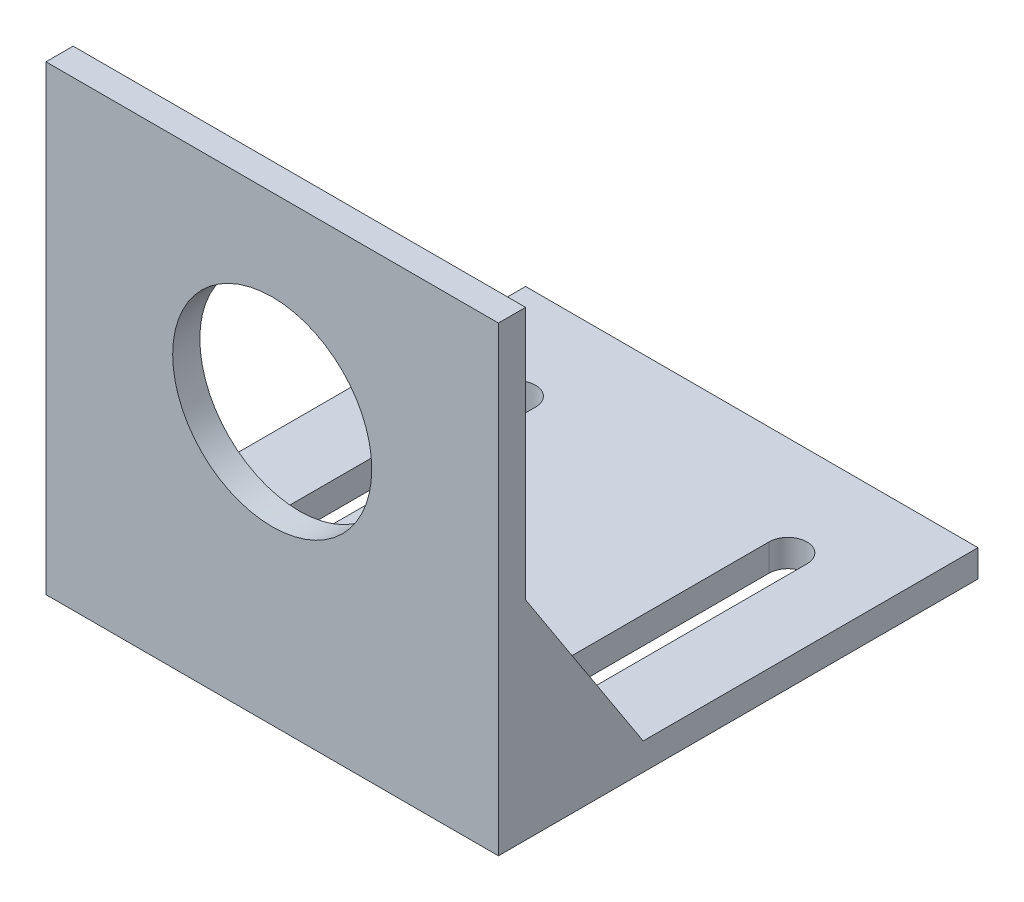
ISO-10303-21;
HEADER;
FILE_DESCRIPTION(('STEP AP214'),'2;1');
FILE_NAME('part.step','',(''),(''),'','','');
FILE_SCHEMA(('AUTOMOTIVE_DESIGN { 1 0 10303 214 1 1 1 1 }'));
ENDSEC;
DATA;
#1=APPLICATION_CONTEXT('core data for automotive mechanical design processes');
#2=APPLICATION_PROTOCOL_DEFINITION('international standard','automotive_design',2000,#1);
#3=PRODUCT_CONTEXT('',#1,'mechanical');
#4=PRODUCT('Part','Part','',(#3));
#5=PRODUCT_RELATED_PRODUCT_CATEGORY('part','',(#4));
#6=PRODUCT_DEFINITION_FORMATION('','',#4);
#7=PRODUCT_DEFINITION_CONTEXT('part definition',#1,'design');
#8=PRODUCT_DEFINITION('design','',#6,#7);
#9=PRODUCT_DEFINITION_SHAPE('','',#8);
#10=(LENGTH_UNIT() NAMED_UNIT(*) SI_UNIT(.MILLI.,.METRE.));
#11=(NAMED_UNIT(*) PLANE_ANGLE_UNIT() SI_UNIT($,.RADIAN.));
#12=(NAMED_UNIT(*) SI_UNIT($,.STERADIAN.) SOLID_ANGLE_UNIT());
#13=UNCERTAINTY_MEASURE_WITH_UNIT(LENGTH_MEASURE(1.E-05),#10,'distance_accuracy_value','');
#14=(GEOMETRIC_REPRESENTATION_CONTEXT(3) GLOBAL_UNCERTAINTY_ASSIGNED_CONTEXT((#13)) GLOBAL_UNIT_ASSIGNED_CONTEXT((#10,
#11,#12)) REPRESENTATION_CONTEXT('',''));
#15=CARTESIAN_POINT('',(0.,0.,0.));
#16=DIRECTION('',(0.,0.,1.));
#17=DIRECTION('',(1.,0.,0.));
#18=AXIS2_PLACEMENT_3D('',#15,#16,#17);
#19=CARTESIAN_POINT('',(0.,3.,0.));
#20=DIRECTION('',(0.,-1.,0.));
#21=DIRECTION('',(0.,0.,-1.));
#22=AXIS2_PLACEMENT_3D('',#19,#20,#21);
#23=PLANE('',#22);
#24=CARTESIAN_POINT('',(40.,3.,-12.));
#25=DIRECTION('',(0.,1.,0.));
#26=DIRECTION('',(0.,0.,-1.));
#27=AXIS2_PLACEMENT_3D('',#24,#25,#26);
#28=CIRCLE('',#27,2.1);
#29=CARTESIAN_POINT('',(37.9,3.,-12.));
#30=VERTEX_POINT('',#29);
#31=CARTESIAN_POINT('',(42.1,3.,-12.));
#32=VERTEX_POINT('',#31);
#33=EDGE_CURVE('E207',#30,#32,#28,.T.);
#34=ORIENTED_EDGE('',*,*,#33,.F.);
#35=DIRECTION('',(0.,0.,1.));
#36=VECTOR('',#35,1.);
#37=CARTESIAN_POINT('',(37.9,3.,-12.));
#38=LINE('',#37,#36);
#39=CARTESIAN_POINT('',(37.9,3.,-42.));
#40=VERTEX_POINT('',#39);
#41=EDGE_CURVE('E214',#40,#30,#38,.T.);
#42=ORIENTED_EDGE('',*,*,#41,.F.);
#43=CARTESIAN_POINT('',(40.,3.,-42.));
#44=DIRECTION('',(0.,1.,0.));
#45=DIRECTION('',(0.,0.,-1.));
#46=AXIS2_PLACEMENT_3D('',#43,#44,#45);
#47=CIRCLE('',#46,2.1);
#48=CARTESIAN_POINT('',(42.1,3.,-42.));
#49=VERTEX_POINT('',#48);
#50=EDGE_CURVE('E212',#49,#40,#47,.T.);
#51=ORIENTED_EDGE('',*,*,#50,.F.);
#52=DIRECTION('',(0.,0.,-1.));
#53=VECTOR('',#52,1.);
#54=CARTESIAN_POINT('',(42.1,3.,-12.));
#55=LINE('',#54,#53);
#56=EDGE_CURVE('E209',#32,#49,#55,.T.);
#57=ORIENTED_EDGE('',*,*,#56,.F.);
#58=EDGE_LOOP('',(#34,#42,#51,#57));
#59=FACE_BOUND('',#58,.T.);
#60=CARTESIAN_POINT('',(10.,3.,-12.));
#61=DIRECTION('',(0.,1.,0.));
#62=DIRECTION('',(0.,0.,1.));
#63=AXIS2_PLACEMENT_3D('',#60,#61,#62);
#64=CIRCLE('',#63,2.1);
#65=CARTESIAN_POINT('',(7.9,3.,-12.));
#66=VERTEX_POINT('',#65);
#67=CARTESIAN_POINT('',(12.1,3.,-12.));
#68=VERTEX_POINT('',#67);
#69=EDGE_CURVE('E236',#66,#68,#64,.T.);
#70=ORIENTED_EDGE('',*,*,#69,.F.);
#71=DIRECTION('',(0.,0.,1.));
#72=VECTOR('',#71,1.);
#73=CARTESIAN_POINT('',(7.9,3.,-12.));
#74=LINE('',#73,#72);
#75=CARTESIAN_POINT('',(7.9,3.,-42.));
#76=VERTEX_POINT('',#75);
#77=EDGE_CURVE('E244',#76,#66,#74,.T.);
#78=ORIENTED_EDGE('',*,*,#77,.F.);
#79=CARTESIAN_POINT('',(10.,3.,-42.));
#80=DIRECTION('',(0.,1.,0.));
#81=DIRECTION('',(0.,0.,1.));
#82=AXIS2_PLACEMENT_3D('',#79,#80,#81);
#83=CIRCLE('',#82,2.1);
#84=CARTESIAN_POINT('',(12.1,3.,-42.));
#85=VERTEX_POINT('',#84);
#86=EDGE_CURVE('E241',#85,#76,#83,.T.);
#87=ORIENTED_EDGE('',*,*,#86,.F.);
#88=DIRECTION('',(0.,0.,-1.));
#89=VECTOR('',#88,1.);
#90=CARTESIAN_POINT('',(12.1,3.,-12.));
#91=LINE('',#90,#89);
#92=EDGE_CURVE('E238',#68,#85,#91,.T.);
#93=ORIENTED_EDGE('',*,*,#92,.F.);
#94=EDGE_LOOP('',(#70,#78,#87,#93));
#95=FACE_BOUND('',#94,.T.);
#96=DIRECTION('',(-1.,0.,0.));
#97=VECTOR('',#96,1.);
#98=CARTESIAN_POINT('',(3.,3.,-16.));
#99=LINE('',#98,#97);
#100=CARTESIAN_POINT('',(3.,3.,-16.));
#101=VERTEX_POINT('',#100);
#102=CARTESIAN_POINT('',(0.,3.,-16.));
#103=VERTEX_POINT('',#102);
#104=EDGE_CURVE('E177',#101,#103,#99,.T.);
#105=ORIENTED_EDGE('',*,*,#104,.F.);
#106=DIRECTION('',(0.,0.,-1.));
#107=VECTOR('',#106,1.);
#108=CARTESIAN_POINT('',(3.,3.,-2.99999999999999));
#109=LINE('',#108,#107);
#110=CARTESIAN_POINT('',(3.,3.,-2.99999999999999));
#111=VERTEX_POINT('',#110);
#112=EDGE_CURVE('E163',#111,#101,#109,.T.);
#113=ORIENTED_EDGE('',*,*,#112,.F.);
#114=DIRECTION('',(1.,0.,0.));
#115=VECTOR('',#114,1.);
#116=CARTESIAN_POINT('',(0.,3.,-3.));
#117=LINE('',#116,#115);
#118=CARTESIAN_POINT('',(47.,3.,-3.));
#119=VERTEX_POINT('',#118);
#120=EDGE_CURVE('E173',#111,#119,#117,.T.);
#121=ORIENTED_EDGE('',*,*,#120,.T.);
#122=DIRECTION('',(0.,0.,-1.));
#123=VECTOR('',#122,1.);
#124=CARTESIAN_POINT('',(47.,3.,-3.));
#125=LINE('',#124,#123);
#126=CARTESIAN_POINT('',(47.,3.,-16.));
#127=VERTEX_POINT('',#126);
#128=EDGE_CURVE('E306',#119,#127,#125,.T.);
#129=ORIENTED_EDGE('',*,*,#128,.T.);
#130=DIRECTION('',(1.,0.,0.));
#131=VECTOR('',#130,1.);
#132=CARTESIAN_POINT('',(47.,3.,-16.));
#133=LINE('',#132,#131);
#134=CARTESIAN_POINT('',(50.,3.,-16.));
#135=VERTEX_POINT('',#134);
#136=EDGE_CURVE('E305',#127,#135,#133,.T.);
#137=ORIENTED_EDGE('',*,*,#136,.T.);
#138=DIRECTION('',(0.,0.,-1.));
#139=VECTOR('',#138,1.);
#140=CARTESIAN_POINT('',(50.,3.,0.));
#141=LINE('',#140,#139);
#142=CARTESIAN_POINT('',(50.,3.,-53.));
#143=VERTEX_POINT('',#142);
#144=EDGE_CURVE('E269',#135,#143,#141,.T.);
#145=ORIENTED_EDGE('',*,*,#144,.T.);
#146=DIRECTION('',(-1.,0.,0.));
#147=VECTOR('',#146,1.);
#148=CARTESIAN_POINT('',(0.,3.,-53.));
#149=LINE('',#148,#147);
#150=CARTESIAN_POINT('',(0.,3.,-53.));
#151=VERTEX_POINT('',#150);
#152=EDGE_CURVE('E272',#143,#151,#149,.T.);
#153=ORIENTED_EDGE('',*,*,#152,.T.);
#154=DIRECTION('',(0.,0.,1.));
#155=VECTOR('',#154,1.);
#156=CARTESIAN_POINT('',(0.,3.,0.));
#157=LINE('',#156,#155);
#158=EDGE_CURVE('E267',#151,#103,#157,.T.);
#159=ORIENTED_EDGE('',*,*,#158,.T.);
#160=EDGE_LOOP('',(#105,#113,#121,#129,#137,#145,#153,#159));
#161=FACE_BOUND('',#160,.T.);
#162=ADVANCED_FACE('F35',(#59,#95,#161),#23,.F.);
#163=CARTESIAN_POINT('',(0.,0.,-3.));
#164=DIRECTION('',(0.,0.,-1.));
#165=DIRECTION('',(-1.,0.,0.));
#166=AXIS2_PLACEMENT_3D('',#163,#164,#165);
#167=PLANE('',#166);
#168=CARTESIAN_POINT('',(25.,30.,-3.));
#169=DIRECTION('',(0.,0.,1.));
#170=DIRECTION('',(1.,0.,0.));
#171=AXIS2_PLACEMENT_3D('',#168,#169,#170);
#172=CIRCLE('',#171,11.);
#173=CARTESIAN_POINT('',(36.,30.,-3.));
#174=VERTEX_POINT('',#173);
#175=EDGE_CURVE('E200',#174,#174,#172,.T.);
#176=ORIENTED_EDGE('',*,*,#175,.T.);
#177=EDGE_LOOP('',(#176));
#178=FACE_BOUND('',#177,.T.);
#179=DIRECTION('',(0.,-1.,0.));
#180=VECTOR('',#179,1.);
#181=CARTESIAN_POINT('',(3.,23.,-2.99999999999999));
#182=LINE('',#181,#180);
#183=CARTESIAN_POINT('',(3.,23.,-2.99999999999999));
#184=VERTEX_POINT('',#183);
#185=EDGE_CURVE('E160',#184,#111,#182,.T.);
#186=ORIENTED_EDGE('',*,*,#185,.F.);
#187=DIRECTION('',(-1.,0.,0.));
#188=VECTOR('',#187,1.);
#189=CARTESIAN_POINT('',(3.,23.,-2.99999999999999));
#190=LINE('',#189,#188);
#191=CARTESIAN_POINT('',(0.,23.,-2.99999999999999));
#192=VERTEX_POINT('',#191);
#193=EDGE_CURVE('E542',#184,#192,#190,.T.);
#194=ORIENTED_EDGE('',*,*,#193,.T.);
#195=DIRECTION('',(0.,-1.,0.));
#196=VECTOR('',#195,1.);
#197=CARTESIAN_POINT('',(0.,3.,-3.));
#198=LINE('',#197,#196);
#199=CARTESIAN_POINT('',(0.,51.,-3.));
#200=VERTEX_POINT('',#199);
#201=EDGE_CURVE('E186',#200,#192,#198,.T.);
#202=ORIENTED_EDGE('',*,*,#201,.F.);
#203=DIRECTION('',(-1.,0.,0.));
#204=VECTOR('',#203,1.);
#205=CARTESIAN_POINT('',(0.,51.,-3.));
#206=LINE('',#205,#204);
#207=CARTESIAN_POINT('',(50.,51.,-3.));
#208=VERTEX_POINT('',#207);
#209=EDGE_CURVE('E188',#208,#200,#206,.T.);
#210=ORIENTED_EDGE('',*,*,#209,.F.);
#211=DIRECTION('',(0.,1.,0.));
#212=VECTOR('',#211,1.);
#213=CARTESIAN_POINT('',(50.,3.,-3.));
#214=LINE('',#213,#212);
#215=CARTESIAN_POINT('',(50.,23.,-3.));
#216=VERTEX_POINT('',#215);
#217=EDGE_CURVE('E185',#216,#208,#214,.T.);
#218=ORIENTED_EDGE('',*,*,#217,.F.);
#219=DIRECTION('',(1.,0.,0.));
#220=VECTOR('',#219,1.);
#221=CARTESIAN_POINT('',(47.,23.,-3.));
#222=LINE('',#221,#220);
#223=CARTESIAN_POINT('',(47.,23.,-3.));
#224=VERTEX_POINT('',#223);
#225=EDGE_CURVE('E309',#224,#216,#222,.T.);
#226=ORIENTED_EDGE('',*,*,#225,.F.);
#227=DIRECTION('',(0.,-1.,0.));
#228=VECTOR('',#227,1.);
#229=CARTESIAN_POINT('',(47.,23.,-3.));
#230=LINE('',#229,#228);
#231=EDGE_CURVE('E184',#224,#119,#230,.T.);
#232=ORIENTED_EDGE('',*,*,#231,.T.);
#233=ORIENTED_EDGE('',*,*,#120,.F.);
#234=EDGE_LOOP('',(#186,#194,#202,#210,#218,#226,#232,#233));
#235=FACE_BOUND('',#234,.T.);
#236=ADVANCED_FACE('F181',(#178,#235),#167,.T.);
#237=CARTESIAN_POINT('',(0.,0.,0.));
#238=DIRECTION('',(0.,-1.,0.));
#239=DIRECTION('',(0.,0.,-1.));
#240=AXIS2_PLACEMENT_3D('',#237,#238,#239);
#241=PLANE('',#240);
#242=DIRECTION('',(0.,0.,1.));
#243=VECTOR('',#242,1.);
#244=CARTESIAN_POINT('',(0.,0.,0.));
#245=LINE('',#244,#243);
#246=CARTESIAN_POINT('',(0.,0.,-53.));
#247=VERTEX_POINT('',#246);
#248=CARTESIAN_POINT('',(0.,0.,0.));
#249=VERTEX_POINT('',#248);
#250=EDGE_CURVE('E266',#247,#249,#245,.T.);
#251=ORIENTED_EDGE('',*,*,#250,.F.);
#252=DIRECTION('',(-1.,0.,0.));
#253=VECTOR('',#252,1.);
#254=CARTESIAN_POINT('',(0.,0.,-53.));
#255=LINE('',#254,#253);
#256=CARTESIAN_POINT('',(50.,0.,-53.));
#257=VERTEX_POINT('',#256);
#258=EDGE_CURVE('E270',#257,#247,#255,.T.);
#259=ORIENTED_EDGE('',*,*,#258,.F.);
#260=DIRECTION('',(0.,0.,-1.));
#261=VECTOR('',#260,1.);
#262=CARTESIAN_POINT('',(50.,0.,0.));
#263=LINE('',#262,#261);
#264=CARTESIAN_POINT('',(50.,0.,0.));
#265=VERTEX_POINT('',#264);
#266=EDGE_CURVE('E279',#265,#257,#263,.T.);
#267=ORIENTED_EDGE('',*,*,#266,.F.);
#268=DIRECTION('',(1.,0.,0.));
#269=VECTOR('',#268,1.);
#270=CARTESIAN_POINT('',(0.,0.,0.));
#271=LINE('',#270,#269);
#272=EDGE_CURVE('E277',#249,#265,#271,.T.);
#273=ORIENTED_EDGE('',*,*,#272,.F.);
#274=EDGE_LOOP('',(#251,#259,#267,#273));
#275=FACE_BOUND('',#274,.T.);
#276=DIRECTION('',(0.,0.,1.));
#277=VECTOR('',#276,1.);
#278=CARTESIAN_POINT('',(7.9,0.,-12.));
#279=LINE('',#278,#277);
#280=CARTESIAN_POINT('',(7.9,0.,-42.));
#281=VERTEX_POINT('',#280);
#282=CARTESIAN_POINT('',(7.9,0.,-12.));
#283=VERTEX_POINT('',#282);
#284=EDGE_CURVE('E239',#281,#283,#279,.T.);
#285=ORIENTED_EDGE('',*,*,#284,.T.);
#286=CARTESIAN_POINT('',(10.,0.,-12.));
#287=DIRECTION('',(0.,1.,0.));
#288=DIRECTION('',(0.,0.,1.));
#289=AXIS2_PLACEMENT_3D('',#286,#287,#288);
#290=CIRCLE('',#289,2.1);
#291=CARTESIAN_POINT('',(12.1,0.,-12.));
#292=VERTEX_POINT('',#291);
#293=EDGE_CURVE('E235',#283,#292,#290,.T.);
#294=ORIENTED_EDGE('',*,*,#293,.T.);
#295=DIRECTION('',(0.,0.,-1.));
#296=VECTOR('',#295,1.);
#297=CARTESIAN_POINT('',(12.1,0.,-12.));
#298=LINE('',#297,#296);
#299=CARTESIAN_POINT('',(12.1,0.,-42.));
#300=VERTEX_POINT('',#299);
#301=EDGE_CURVE('E249',#292,#300,#298,.T.);
#302=ORIENTED_EDGE('',*,*,#301,.T.);
#303=CARTESIAN_POINT('',(10.,0.,-42.));
#304=DIRECTION('',(0.,1.,0.));
#305=DIRECTION('',(0.,0.,1.));
#306=AXIS2_PLACEMENT_3D('',#303,#304,#305);
#307=CIRCLE('',#306,2.1);
#308=EDGE_CURVE('E252',#300,#281,#307,.T.);
#309=ORIENTED_EDGE('',*,*,#308,.T.);
#310=EDGE_LOOP('',(#285,#294,#302,#309));
#311=FACE_BOUND('',#310,.T.);
#312=DIRECTION('',(0.,0.,1.));
#313=VECTOR('',#312,1.);
#314=CARTESIAN_POINT('',(37.9,0.,-12.));
#315=LINE('',#314,#313);
#316=CARTESIAN_POINT('',(37.9,0.,-42.));
#317=VERTEX_POINT('',#316);
#318=CARTESIAN_POINT('',(37.9,0.,-12.));
#319=VERTEX_POINT('',#318);
#320=EDGE_CURVE('E210',#317,#319,#315,.T.);
#321=ORIENTED_EDGE('',*,*,#320,.T.);
#322=CARTESIAN_POINT('',(40.,0.,-12.));
#323=DIRECTION('',(0.,1.,0.));
#324=DIRECTION('',(0.,0.,-1.));
#325=AXIS2_PLACEMENT_3D('',#322,#323,#324);
#326=CIRCLE('',#325,2.1);
#327=CARTESIAN_POINT('',(42.1,0.,-12.));
#328=VERTEX_POINT('',#327);
#329=EDGE_CURVE('E204',#319,#328,#326,.T.);
#330=ORIENTED_EDGE('',*,*,#329,.T.);
#331=DIRECTION('',(0.,0.,-1.));
#332=VECTOR('',#331,1.);
#333=CARTESIAN_POINT('',(42.1,0.,-12.));
#334=LINE('',#333,#332);
#335=CARTESIAN_POINT('',(42.1,0.,-42.));
#336=VERTEX_POINT('',#335);
#337=EDGE_CURVE('E219',#328,#336,#334,.T.);
#338=ORIENTED_EDGE('',*,*,#337,.T.);
#339=CARTESIAN_POINT('',(40.,0.,-42.));
#340=DIRECTION('',(0.,1.,0.));
#341=DIRECTION('',(0.,0.,-1.));
#342=AXIS2_PLACEMENT_3D('',#339,#340,#341);
#343=CIRCLE('',#342,2.1);
#344=EDGE_CURVE('E222',#336,#317,#343,.T.);
#345=ORIENTED_EDGE('',*,*,#344,.T.);
#346=EDGE_LOOP('',(#321,#330,#338,#345));
#347=FACE_BOUND('',#346,.T.);
#348=ADVANCED_FACE('F296',(#275,#311,#347),#241,.T.);
#349=CARTESIAN_POINT('',(0.,3.,0.));
#350=DIRECTION('',(1.,0.,0.));
#351=DIRECTION('',(0.,0.,-1.));
#352=AXIS2_PLACEMENT_3D('',#349,#350,#351);
#353=PLANE('',#352);
#354=DIRECTION('',(0.,0.838443616300637,0.544988350595414));
#355=VECTOR('',#354,1.);
#356=CARTESIAN_POINT('',(0.,3.,-16.));
#357=LINE('',#356,#355);
#358=EDGE_CURVE('E178',#103,#192,#357,.T.);
#359=ORIENTED_EDGE('',*,*,#358,.F.);
#360=ORIENTED_EDGE('',*,*,#158,.F.);
#361=DIRECTION('',(0.,-1.,0.));
#362=VECTOR('',#361,1.);
#363=CARTESIAN_POINT('',(0.,3.,-53.));
#364=LINE('',#363,#362);
#365=EDGE_CURVE('E274',#151,#247,#364,.T.);
#366=ORIENTED_EDGE('',*,*,#365,.T.);
#367=ORIENTED_EDGE('',*,*,#250,.T.);
#368=DIRECTION('',(0.,-1.,0.));
#369=VECTOR('',#368,1.);
#370=CARTESIAN_POINT('',(0.,3.,0.));
#371=LINE('',#370,#369);
#372=CARTESIAN_POINT('',(0.,51.,0.));
#373=VERTEX_POINT('',#372);
#374=EDGE_CURVE('E11',#373,#249,#371,.T.);
#375=ORIENTED_EDGE('',*,*,#374,.F.);
#376=DIRECTION('',(0.,0.,1.));
#377=VECTOR('',#376,1.);
#378=CARTESIAN_POINT('',(0.,51.,-3.));
#379=LINE('',#378,#377);
#380=EDGE_CURVE('E201',#200,#373,#379,.T.);
#381=ORIENTED_EDGE('',*,*,#380,.F.);
#382=ORIENTED_EDGE('',*,*,#201,.T.);
#383=EDGE_LOOP('',(#359,#360,#366,#367,#375,#381,#382));
#384=FACE_BOUND('',#383,.T.);
#385=ADVANCED_FACE('F37',(#384),#353,.F.);
#386=CARTESIAN_POINT('',(0.,3.,0.));
#387=DIRECTION('',(0.,0.,-1.));
#388=DIRECTION('',(-1.,0.,0.));
#389=AXIS2_PLACEMENT_3D('',#386,#387,#388);
#390=PLANE('',#389);
#391=ORIENTED_EDGE('',*,*,#272,.T.);
#392=DIRECTION('',(0.,-1.,0.));
#393=VECTOR('',#392,1.);
#394=CARTESIAN_POINT('',(50.,3.,0.));
#395=LINE('',#394,#393);
#396=CARTESIAN_POINT('',(50.,51.,0.));
#397=VERTEX_POINT('',#396);
#398=EDGE_CURVE('E43',#397,#265,#395,.T.);
#399=ORIENTED_EDGE('',*,*,#398,.F.);
#400=DIRECTION('',(-1.,0.,0.));
#401=VECTOR('',#400,1.);
#402=CARTESIAN_POINT('',(0.,51.,0.));
#403=LINE('',#402,#401);
#404=EDGE_CURVE('E191',#397,#373,#403,.T.);
#405=ORIENTED_EDGE('',*,*,#404,.T.);
#406=ORIENTED_EDGE('',*,*,#374,.T.);
#407=EDGE_LOOP('',(#391,#399,#405,#406));
#408=FACE_BOUND('',#407,.T.);
#409=CARTESIAN_POINT('',(25.,30.,0.));
#410=DIRECTION('',(0.,0.,1.));
#411=DIRECTION('',(1.,0.,0.));
#412=AXIS2_PLACEMENT_3D('',#409,#410,#411);
#413=CIRCLE('',#412,11.);
#414=CARTESIAN_POINT('',(36.,30.,0.));
#415=VERTEX_POINT('',#414);
#416=EDGE_CURVE('E311',#415,#415,#413,.T.);
#417=ORIENTED_EDGE('',*,*,#416,.F.);
#418=EDGE_LOOP('',(#417));
#419=FACE_BOUND('',#418,.T.);
#420=ADVANCED_FACE('F323',(#408,#419),#390,.F.);
#421=CARTESIAN_POINT('',(50.,3.,0.));
#422=DIRECTION('',(-1.,0.,0.));
#423=DIRECTION('',(0.,0.,1.));
#424=AXIS2_PLACEMENT_3D('',#421,#422,#423);
#425=PLANE('',#424);
#426=ORIENTED_EDGE('',*,*,#144,.F.);
#427=DIRECTION('',(0.,0.838443616300637,0.544988350595414));
#428=VECTOR('',#427,1.);
#429=CARTESIAN_POINT('',(50.,3.,-16.));
#430=LINE('',#429,#428);
#431=EDGE_CURVE('E50',#135,#216,#430,.T.);
#432=ORIENTED_EDGE('',*,*,#431,.T.);
#433=ORIENTED_EDGE('',*,*,#217,.T.);
#434=DIRECTION('',(0.,0.,1.));
#435=VECTOR('',#434,1.);
#436=CARTESIAN_POINT('',(50.,51.,-3.));
#437=LINE('',#436,#435);
#438=EDGE_CURVE('E197',#208,#397,#437,.T.);
#439=ORIENTED_EDGE('',*,*,#438,.T.);
#440=ORIENTED_EDGE('',*,*,#398,.T.);
#441=ORIENTED_EDGE('',*,*,#266,.T.);
#442=DIRECTION('',(0.,-1.,0.));
#443=VECTOR('',#442,1.);
#444=CARTESIAN_POINT('',(50.,3.,-53.));
#445=LINE('',#444,#443);
#446=EDGE_CURVE('E284',#143,#257,#445,.T.);
#447=ORIENTED_EDGE('',*,*,#446,.F.);
#448=EDGE_LOOP('',(#426,#432,#433,#439,#440,#441,#447));
#449=FACE_BOUND('',#448,.T.);
#450=ADVANCED_FACE('F288',(#449),#425,.F.);
#451=CARTESIAN_POINT('',(0.,3.,-53.));
#452=DIRECTION('',(0.,0.,1.));
#453=DIRECTION('',(1.,0.,0.));
#454=AXIS2_PLACEMENT_3D('',#451,#452,#453);
#455=PLANE('',#454);
#456=ORIENTED_EDGE('',*,*,#258,.T.);
#457=ORIENTED_EDGE('',*,*,#365,.F.);
#458=ORIENTED_EDGE('',*,*,#152,.F.);
#459=ORIENTED_EDGE('',*,*,#446,.T.);
#460=EDGE_LOOP('',(#456,#457,#458,#459));
#461=FACE_BOUND('',#460,.T.);
#462=ADVANCED_FACE('F300',(#461),#455,.F.);
#463=CARTESIAN_POINT('',(10.,3.,-12.));
#464=DIRECTION('',(0.,-1.,0.));
#465=DIRECTION('',(0.,0.,-1.));
#466=AXIS2_PLACEMENT_3D('',#463,#464,#465);
#467=CYLINDRICAL_SURFACE('',#466,2.1);
#468=ORIENTED_EDGE('',*,*,#293,.F.);
#469=DIRECTION('',(0.,-1.,0.));
#470=VECTOR('',#469,1.);
#471=CARTESIAN_POINT('',(7.9,3.,-12.));
#472=LINE('',#471,#470);
#473=EDGE_CURVE('E246',#66,#283,#472,.T.);
#474=ORIENTED_EDGE('',*,*,#473,.F.);
#475=ORIENTED_EDGE('',*,*,#69,.T.);
#476=DIRECTION('',(0.,-1.,0.));
#477=VECTOR('',#476,1.);
#478=CARTESIAN_POINT('',(12.1,3.,-12.));
#479=LINE('',#478,#477);
#480=EDGE_CURVE('E263',#68,#292,#479,.T.);
#481=ORIENTED_EDGE('',*,*,#480,.T.);
#482=EDGE_LOOP('',(#468,#474,#475,#481));
#483=FACE_BOUND('',#482,.T.);
#484=ADVANCED_FACE('F342',(#483),#467,.F.);
#485=CARTESIAN_POINT('',(12.1,3.,-12.));
#486=DIRECTION('',(-1.,0.,0.));
#487=DIRECTION('',(0.,0.,1.));
#488=AXIS2_PLACEMENT_3D('',#485,#486,#487);
#489=PLANE('',#488);
#490=ORIENTED_EDGE('',*,*,#301,.F.);
#491=ORIENTED_EDGE('',*,*,#480,.F.);
#492=ORIENTED_EDGE('',*,*,#92,.T.);
#493=DIRECTION('',(0.,-1.,0.));
#494=VECTOR('',#493,1.);
#495=CARTESIAN_POINT('',(12.1,3.,-42.));
#496=LINE('',#495,#494);
#497=EDGE_CURVE('E261',#85,#300,#496,.T.);
#498=ORIENTED_EDGE('',*,*,#497,.T.);
#499=EDGE_LOOP('',(#490,#491,#492,#498));
#500=FACE_BOUND('',#499,.T.);
#501=ADVANCED_FACE('F350',(#500),#489,.T.);
#502=CARTESIAN_POINT('',(10.,3.,-42.));
#503=DIRECTION('',(0.,-1.,0.));
#504=DIRECTION('',(0.,0.,-1.));
#505=AXIS2_PLACEMENT_3D('',#502,#503,#504);
#506=CYLINDRICAL_SURFACE('',#505,2.1);
#507=ORIENTED_EDGE('',*,*,#308,.F.);
#508=ORIENTED_EDGE('',*,*,#497,.F.);
#509=ORIENTED_EDGE('',*,*,#86,.T.);
#510=DIRECTION('',(0.,-1.,0.));
#511=VECTOR('',#510,1.);
#512=CARTESIAN_POINT('',(7.9,3.,-42.));
#513=LINE('',#512,#511);
#514=EDGE_CURVE('E259',#76,#281,#513,.T.);
#515=ORIENTED_EDGE('',*,*,#514,.T.);
#516=EDGE_LOOP('',(#507,#508,#509,#515));
#517=FACE_BOUND('',#516,.T.);
#518=ADVANCED_FACE('F355',(#517),#506,.F.);
#519=CARTESIAN_POINT('',(7.9,3.,-12.));
#520=DIRECTION('',(1.,0.,0.));
#521=DIRECTION('',(0.,0.,-1.));
#522=AXIS2_PLACEMENT_3D('',#519,#520,#521);
#523=PLANE('',#522);
#524=ORIENTED_EDGE('',*,*,#284,.F.);
#525=ORIENTED_EDGE('',*,*,#514,.F.);
#526=ORIENTED_EDGE('',*,*,#77,.T.);
#527=ORIENTED_EDGE('',*,*,#473,.T.);
#528=EDGE_LOOP('',(#524,#525,#526,#527));
#529=FACE_BOUND('',#528,.T.);
#530=ADVANCED_FACE('F362',(#529),#523,.T.);
#531=CARTESIAN_POINT('',(40.,3.,-12.));
#532=DIRECTION('',(0.,-1.,0.));
#533=DIRECTION('',(0.,0.,-1.));
#534=AXIS2_PLACEMENT_3D('',#531,#532,#533);
#535=CYLINDRICAL_SURFACE('',#534,2.1);
#536=ORIENTED_EDGE('',*,*,#329,.F.);
#537=DIRECTION('',(0.,-1.,0.));
#538=VECTOR('',#537,1.);
#539=CARTESIAN_POINT('',(37.9,3.,-12.));
#540=LINE('',#539,#538);
#541=EDGE_CURVE('E216',#30,#319,#540,.T.);
#542=ORIENTED_EDGE('',*,*,#541,.F.);
#543=ORIENTED_EDGE('',*,*,#33,.T.);
#544=DIRECTION('',(0.,-1.,0.));
#545=VECTOR('',#544,1.);
#546=CARTESIAN_POINT('',(42.1,3.,-12.));
#547=LINE('',#546,#545);
#548=EDGE_CURVE('E232',#32,#328,#547,.T.);
#549=ORIENTED_EDGE('',*,*,#548,.T.);
#550=EDGE_LOOP('',(#536,#542,#543,#549));
#551=FACE_BOUND('',#550,.T.);
#552=ADVANCED_FACE('F375',(#551),#535,.F.);
#553=CARTESIAN_POINT('',(42.1,3.,-12.));
#554=DIRECTION('',(-1.,0.,0.));
#555=DIRECTION('',(0.,0.,1.));
#556=AXIS2_PLACEMENT_3D('',#553,#554,#555);
#557=PLANE('',#556);
#558=ORIENTED_EDGE('',*,*,#337,.F.);
#559=ORIENTED_EDGE('',*,*,#548,.F.);
#560=ORIENTED_EDGE('',*,*,#56,.T.);
#561=DIRECTION('',(0.,-1.,0.));
#562=VECTOR('',#561,1.);
#563=CARTESIAN_POINT('',(42.1,3.,-42.));
#564=LINE('',#563,#562);
#565=EDGE_CURVE('E230',#49,#336,#564,.T.);
#566=ORIENTED_EDGE('',*,*,#565,.T.);
#567=EDGE_LOOP('',(#558,#559,#560,#566));
#568=FACE_BOUND('',#567,.T.);
#569=ADVANCED_FACE('F380',(#568),#557,.T.);
#570=CARTESIAN_POINT('',(40.,3.,-42.));
#571=DIRECTION('',(0.,-1.,0.));
#572=DIRECTION('',(0.,0.,-1.));
#573=AXIS2_PLACEMENT_3D('',#570,#571,#572);
#574=CYLINDRICAL_SURFACE('',#573,2.1);
#575=ORIENTED_EDGE('',*,*,#344,.F.);
#576=ORIENTED_EDGE('',*,*,#565,.F.);
#577=ORIENTED_EDGE('',*,*,#50,.T.);
#578=DIRECTION('',(0.,-1.,0.));
#579=VECTOR('',#578,1.);
#580=CARTESIAN_POINT('',(37.9,3.,-42.));
#581=LINE('',#580,#579);
#582=EDGE_CURVE('E58',#40,#317,#581,.T.);
#583=ORIENTED_EDGE('',*,*,#582,.T.);
#584=EDGE_LOOP('',(#575,#576,#577,#583));
#585=FACE_BOUND('',#584,.T.);
#586=ADVANCED_FACE('F384',(#585),#574,.F.);
#587=CARTESIAN_POINT('',(37.9,3.,-12.));
#588=DIRECTION('',(1.,0.,0.));
#589=DIRECTION('',(0.,0.,-1.));
#590=AXIS2_PLACEMENT_3D('',#587,#588,#589);
#591=PLANE('',#590);
#592=ORIENTED_EDGE('',*,*,#320,.F.);
#593=ORIENTED_EDGE('',*,*,#582,.F.);
#594=ORIENTED_EDGE('',*,*,#41,.T.);
#595=ORIENTED_EDGE('',*,*,#541,.T.);
#596=EDGE_LOOP('',(#592,#593,#594,#595));
#597=FACE_BOUND('',#596,.T.);
#598=ADVANCED_FACE('F388',(#597),#591,.T.);
#599=CARTESIAN_POINT('',(0.,51.,-3.));
#600=DIRECTION('',(0.,1.,0.));
#601=DIRECTION('',(0.,0.,1.));
#602=AXIS2_PLACEMENT_3D('',#599,#600,#601);
#603=PLANE('',#602);
#604=ORIENTED_EDGE('',*,*,#404,.F.);
#605=ORIENTED_EDGE('',*,*,#438,.F.);
#606=ORIENTED_EDGE('',*,*,#209,.T.);
#607=ORIENTED_EDGE('',*,*,#380,.T.);
#608=EDGE_LOOP('',(#604,#605,#606,#607));
#609=FACE_BOUND('',#608,.T.);
#610=ADVANCED_FACE('F392',(#609),#603,.T.);
#611=CARTESIAN_POINT('',(25.,30.,-3.));
#612=DIRECTION('',(0.,0.,1.));
#613=DIRECTION('',(1.,0.,0.));
#614=AXIS2_PLACEMENT_3D('',#611,#612,#613);
#615=CYLINDRICAL_SURFACE('',#614,11.);
#616=ORIENTED_EDGE('',*,*,#175,.F.);
#617=EDGE_LOOP('',(#616));
#618=FACE_BOUND('',#617,.T.);
#619=ORIENTED_EDGE('',*,*,#416,.T.);
#620=EDGE_LOOP('',(#619));
#621=FACE_BOUND('',#620,.T.);
#622=ADVANCED_FACE('F321',(#618,#621),#615,.F.);
#623=CARTESIAN_POINT('',(47.,3.,-16.));
#624=DIRECTION('',(0.,0.544988350595414,-0.838443616300637));
#625=DIRECTION('',(0.,0.838443616300637,0.544988350595414));
#626=AXIS2_PLACEMENT_3D('',#623,#624,#625);
#627=PLANE('',#626);
#628=ORIENTED_EDGE('',*,*,#431,.F.);
#629=ORIENTED_EDGE('',*,*,#136,.F.);
#630=DIRECTION('',(0.,0.838443616300637,0.544988350595414));
#631=VECTOR('',#630,1.);
#632=CARTESIAN_POINT('',(47.,3.,-16.));
#633=LINE('',#632,#631);
#634=EDGE_CURVE('E313',#127,#224,#633,.T.);
#635=ORIENTED_EDGE('',*,*,#634,.T.);
#636=ORIENTED_EDGE('',*,*,#225,.T.);
#637=EDGE_LOOP('',(#628,#629,#635,#636));
#638=FACE_BOUND('',#637,.T.);
#639=ADVANCED_FACE('F398',(#638),#627,.T.);
#640=CARTESIAN_POINT('',(47.,0.,0.));
#641=DIRECTION('',(-1.,0.,0.));
#642=DIRECTION('',(0.,0.,1.));
#643=AXIS2_PLACEMENT_3D('',#640,#641,#642);
#644=PLANE('',#643);
#645=ORIENTED_EDGE('',*,*,#128,.F.);
#646=ORIENTED_EDGE('',*,*,#231,.F.);
#647=ORIENTED_EDGE('',*,*,#634,.F.);
#648=EDGE_LOOP('',(#645,#646,#647));
#649=FACE_BOUND('',#648,.T.);
#650=ADVANCED_FACE('F402',(#649),#644,.T.);
#651=CARTESIAN_POINT('',(3.,3.,-16.));
#652=DIRECTION('',(0.,-0.544988350595414,0.838443616300637));
#653=DIRECTION('',(0.,-0.838443616300637,-0.544988350595414));
#654=AXIS2_PLACEMENT_3D('',#651,#652,#653);
#655=PLANE('',#654);
#656=ORIENTED_EDGE('',*,*,#358,.T.);
#657=ORIENTED_EDGE('',*,*,#193,.F.);
#658=DIRECTION('',(0.,0.838443616300637,0.544988350595414));
#659=VECTOR('',#658,1.);
#660=CARTESIAN_POINT('',(3.,3.,-16.));
#661=LINE('',#660,#659);
#662=EDGE_CURVE('E165',#101,#184,#661,.T.);
#663=ORIENTED_EDGE('',*,*,#662,.F.);
#664=ORIENTED_EDGE('',*,*,#104,.T.);
#665=EDGE_LOOP('',(#656,#657,#663,#664));
#666=FACE_BOUND('',#665,.T.);
#667=ADVANCED_FACE('F405',(#666),#655,.F.);
#668=CARTESIAN_POINT('',(3.,0.,0.));
#669=DIRECTION('',(1.,0.,0.));
#670=DIRECTION('',(0.,0.,1.));
#671=AXIS2_PLACEMENT_3D('',#668,#669,#670);
#672=PLANE('',#671);
#673=ORIENTED_EDGE('',*,*,#112,.T.);
#674=ORIENTED_EDGE('',*,*,#662,.T.);
#675=ORIENTED_EDGE('',*,*,#185,.T.);
#676=EDGE_LOOP('',(#673,#674,#675));
#677=FACE_BOUND('',#676,.T.);
#678=ADVANCED_FACE('F162',(#677),#672,.T.);
#679=CLOSED_SHELL('',(#162,#236,#348,#385,#420,#450,#462,#484,#501,#518,#530,#552,#569,#586,
#598,#610,#622,#639,#650,#667,#678));
#680=MANIFOLD_SOLID_BREP('B2',#679);
#681=ADVANCED_BREP_SHAPE_REPRESENTATION('',(#18,#680),#14);
#682=SHAPE_DEFINITION_REPRESENTATION(#9,#681);
ENDSEC;
END-ISO-10303-21;
